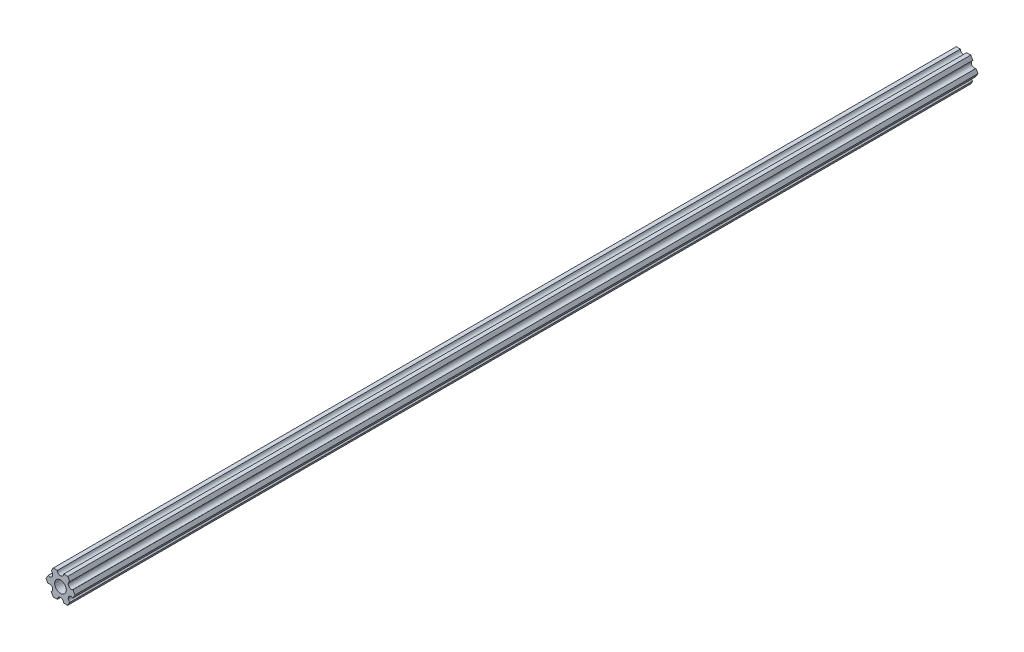
ISO-10303-21;
HEADER;
FILE_DESCRIPTION(('STEP AP214'),'2;1');
FILE_NAME('part.step','',(''),(''),'','','');
FILE_SCHEMA(('AUTOMOTIVE_DESIGN { 1 0 10303 214 1 1 1 1 }'));
ENDSEC;
DATA;
#1=APPLICATION_CONTEXT('core data for automotive mechanical design processes');
#2=APPLICATION_PROTOCOL_DEFINITION('international standard','automotive_design',2000,#1);
#3=PRODUCT_CONTEXT('',#1,'mechanical');
#4=PRODUCT('Part','Part','',(#3));
#5=PRODUCT_RELATED_PRODUCT_CATEGORY('part','',(#4));
#6=PRODUCT_DEFINITION_FORMATION('','',#4);
#7=PRODUCT_DEFINITION_CONTEXT('part definition',#1,'design');
#8=PRODUCT_DEFINITION('design','',#6,#7);
#9=PRODUCT_DEFINITION_SHAPE('','',#8);
#10=(LENGTH_UNIT() NAMED_UNIT(*) SI_UNIT(.MILLI.,.METRE.));
#11=(NAMED_UNIT(*) PLANE_ANGLE_UNIT() SI_UNIT($,.RADIAN.));
#12=(NAMED_UNIT(*) SI_UNIT($,.STERADIAN.) SOLID_ANGLE_UNIT());
#13=UNCERTAINTY_MEASURE_WITH_UNIT(LENGTH_MEASURE(1.E-05),#10,'distance_accuracy_value','');
#14=(GEOMETRIC_REPRESENTATION_CONTEXT(3) GLOBAL_UNCERTAINTY_ASSIGNED_CONTEXT((#13)) GLOBAL_UNIT_ASSIGNED_CONTEXT((#10,
#11,#12)) REPRESENTATION_CONTEXT('',''));
#15=CARTESIAN_POINT('',(0.,0.,0.));
#16=DIRECTION('',(0.,0.,1.));
#17=DIRECTION('',(1.,0.,0.));
#18=AXIS2_PLACEMENT_3D('',#15,#16,#17);
#19=CARTESIAN_POINT('',(0.,0.,228.6));
#20=DIRECTION('',(0.,0.,-1.));
#21=DIRECTION('',(-1.,0.,0.));
#22=AXIS2_PLACEMENT_3D('',#19,#20,#21);
#23=CYLINDRICAL_SURFACE('',#22,2.9337);
#24=DIRECTION('',(0.,0.,-1.));
#25=VECTOR('',#24,1.);
#26=CARTESIAN_POINT('',(2.9337,0.,228.6));
#27=LINE('',#26,#25);
#28=CARTESIAN_POINT('',(2.9337,0.,228.6));
#29=VERTEX_POINT('',#28);
#30=CARTESIAN_POINT('',(2.9337,0.,-228.6));
#31=VERTEX_POINT('',#30);
#32=EDGE_CURVE('E225',#29,#31,#27,.T.);
#33=ORIENTED_EDGE('',*,*,#32,.F.);
#34=CARTESIAN_POINT('',(0.,0.,228.6));
#35=DIRECTION('',(0.,0.,1.));
#36=DIRECTION('',(1.,0.,0.));
#37=AXIS2_PLACEMENT_3D('',#34,#35,#36);
#38=CIRCLE('',#37,2.9337);
#39=CARTESIAN_POINT('',(-2.9337,0.,228.6));
#40=VERTEX_POINT('',#39);
#41=EDGE_CURVE('E220',#29,#40,#38,.T.);
#42=ORIENTED_EDGE('',*,*,#41,.T.);
#43=DIRECTION('',(0.,0.,-1.));
#44=VECTOR('',#43,1.);
#45=CARTESIAN_POINT('',(-2.9337,0.,228.6));
#46=LINE('',#45,#44);
#47=CARTESIAN_POINT('',(-2.9337,0.,-228.6));
#48=VERTEX_POINT('',#47);
#49=EDGE_CURVE('E222',#40,#48,#46,.T.);
#50=ORIENTED_EDGE('',*,*,#49,.T.);
#51=CARTESIAN_POINT('',(0.,0.,-228.6));
#52=DIRECTION('',(0.,0.,1.));
#53=DIRECTION('',(1.,0.,0.));
#54=AXIS2_PLACEMENT_3D('',#51,#52,#53);
#55=CIRCLE('',#54,2.9337);
#56=EDGE_CURVE('E381',#31,#48,#55,.T.);
#57=ORIENTED_EDGE('',*,*,#56,.F.);
#58=EDGE_LOOP('',(#33,#42,#50,#57));
#59=FACE_BOUND('',#58,.T.);
#60=ADVANCED_FACE('F16',(#59),#23,.F.);
#61=CARTESIAN_POINT('',(5.49926150638082,-3.17499966684067,228.6));
#62=DIRECTION('',(0.,0.,-1.));
#63=DIRECTION('',(-1.,0.,0.));
#64=AXIS2_PLACEMENT_3D('',#61,#62,#63);
#65=CYLINDRICAL_SURFACE('',#64,1.5875);
#66=DIRECTION('',(0.,0.,-1.));
#67=VECTOR('',#66,1.);
#68=CARTESIAN_POINT('',(3.91176150638082,-3.17499966684067,228.6));
#69=LINE('',#68,#67);
#70=CARTESIAN_POINT('',(3.91176150638082,-3.17499966684067,228.6));
#71=VERTEX_POINT('',#70);
#72=CARTESIAN_POINT('',(3.91176150638082,-3.17499966684067,-228.6));
#73=VERTEX_POINT('',#72);
#74=EDGE_CURVE('E274',#71,#73,#69,.T.);
#75=ORIENTED_EDGE('',*,*,#74,.F.);
#76=CARTESIAN_POINT('',(5.49926150638082,-3.17499966684067,228.6));
#77=DIRECTION('',(0.,0.,-1.));
#78=DIRECTION('',(1.,0.,0.));
#79=AXIS2_PLACEMENT_3D('',#76,#77,#78);
#80=CIRCLE('',#79,1.5875);
#81=CARTESIAN_POINT('',(4.70551158967065,-4.54981504343587,228.6));
#82=VERTEX_POINT('',#81);
#83=EDGE_CURVE('E231',#82,#71,#80,.T.);
#84=ORIENTED_EDGE('',*,*,#83,.F.);
#85=DIRECTION('',(0.,0.,-1.));
#86=VECTOR('',#85,1.);
#87=CARTESIAN_POINT('',(4.70551158967065,-4.54981504343587,228.6));
#88=LINE('',#87,#86);
#89=CARTESIAN_POINT('',(4.70551158967065,-4.54981504343587,-228.6));
#90=VERTEX_POINT('',#89);
#91=EDGE_CURVE('E10',#82,#90,#88,.T.);
#92=ORIENTED_EDGE('',*,*,#91,.T.);
#93=CARTESIAN_POINT('',(5.49926150638082,-3.17499966684067,-228.6));
#94=DIRECTION('',(0.,0.,-1.));
#95=DIRECTION('',(1.,0.,0.));
#96=AXIS2_PLACEMENT_3D('',#93,#94,#95);
#97=CIRCLE('',#96,1.5875);
#98=EDGE_CURVE('E262',#90,#73,#97,.T.);
#99=ORIENTED_EDGE('',*,*,#98,.T.);
#100=EDGE_LOOP('',(#75,#84,#92,#99));
#101=FACE_BOUND('',#100,.T.);
#102=ADVANCED_FACE('F974',(#101),#65,.F.);
#103=CARTESIAN_POINT('',(3.66617459405346,-6.34999977789375,228.6));
#104=DIRECTION('',(-0.86602543407573,0.499999947533941,0.));
#105=DIRECTION('',(0.,0.,1.));
#106=AXIS2_PLACEMENT_3D('',#103,#104,#105);
#107=PLANE('',#106);
#108=DIRECTION('',(0.499999947533941,0.86602543407573,0.));
#109=VECTOR('',#108,1.);
#110=CARTESIAN_POINT('',(3.66617459405346,-6.34999977789375,-228.6));
#111=LINE('',#110,#109);
#112=CARTESIAN_POINT('',(3.66617459405346,-6.34999977789375,-228.6));
#113=VERTEX_POINT('',#112);
#114=EDGE_CURVE('E257',#113,#90,#111,.T.);
#115=ORIENTED_EDGE('',*,*,#114,.T.);
#116=ORIENTED_EDGE('',*,*,#91,.F.);
#117=DIRECTION('',(0.499999947533941,0.86602543407573,0.));
#118=VECTOR('',#117,1.);
#119=CARTESIAN_POINT('',(3.66617459405346,-6.34999977789375,228.6));
#120=LINE('',#119,#118);
#121=CARTESIAN_POINT('',(3.66617459405346,-6.34999977789375,228.6));
#122=VERTEX_POINT('',#121);
#123=EDGE_CURVE('E318',#122,#82,#120,.T.);
#124=ORIENTED_EDGE('',*,*,#123,.F.);
#125=DIRECTION('',(0.,0.,-1.));
#126=VECTOR('',#125,1.);
#127=CARTESIAN_POINT('',(3.66617459405346,-6.34999977789375,228.6));
#128=LINE('',#127,#126);
#129=EDGE_CURVE('E25',#122,#113,#128,.T.);
#130=ORIENTED_EDGE('',*,*,#129,.T.);
#131=EDGE_LOOP('',(#115,#116,#124,#130));
#132=FACE_BOUND('',#131,.T.);
#133=ADVANCED_FACE('F965',(#132),#107,.F.);
#134=CARTESIAN_POINT('',(1.58750038469926,-6.34999990382518,228.6));
#135=DIRECTION('',(-6.05825721258438E-08,1.,0.));
#136=DIRECTION('',(0.,0.,1.));
#137=AXIS2_PLACEMENT_3D('',#134,#135,#136);
#138=PLANE('',#137);
#139=DIRECTION('',(1.,6.05825721258438E-08,0.));
#140=VECTOR('',#139,1.);
#141=CARTESIAN_POINT('',(1.58750038469926,-6.34999990382518,-228.6));
#142=LINE('',#141,#140);
#143=CARTESIAN_POINT('',(1.58750038469926,-6.34999990382518,-228.6));
#144=VERTEX_POINT('',#143);
#145=EDGE_CURVE('E261',#144,#113,#142,.T.);
#146=ORIENTED_EDGE('',*,*,#145,.T.);
#147=ORIENTED_EDGE('',*,*,#129,.F.);
#148=DIRECTION('',(1.,6.05825721258438E-08,0.));
#149=VECTOR('',#148,1.);
#150=CARTESIAN_POINT('',(1.58750038469926,-6.34999990382518,228.6));
#151=LINE('',#150,#149);
#152=CARTESIAN_POINT('',(1.58750038469926,-6.34999990382518,228.6));
#153=VERTEX_POINT('',#152);
#154=EDGE_CURVE('E322',#153,#122,#151,.T.);
#155=ORIENTED_EDGE('',*,*,#154,.F.);
#156=DIRECTION('',(0.,0.,-1.));
#157=VECTOR('',#156,1.);
#158=CARTESIAN_POINT('',(1.58750038469926,-6.34999990382518,228.6));
#159=LINE('',#158,#157);
#160=EDGE_CURVE('E19',#153,#144,#159,.T.);
#161=ORIENTED_EDGE('',*,*,#160,.T.);
#162=EDGE_LOOP('',(#146,#147,#155,#161));
#163=FACE_BOUND('',#162,.T.);
#164=ADVANCED_FACE('F957',(#163),#138,.F.);
#165=CARTESIAN_POINT('',(3.8469926204343E-07,-6.35,228.6));
#166=DIRECTION('',(0.,0.,-1.));
#167=DIRECTION('',(-1.,0.,0.));
#168=AXIS2_PLACEMENT_3D('',#165,#166,#167);
#169=CYLINDRICAL_SURFACE('',#168,1.5875);
#170=CARTESIAN_POINT('',(3.8469926204343E-07,-6.35,-228.6));
#171=DIRECTION('',(0.,0.,-1.));
#172=DIRECTION('',(1.,0.,0.));
#173=AXIS2_PLACEMENT_3D('',#170,#171,#172);
#174=CIRCLE('',#173,1.5875);
#175=CARTESIAN_POINT('',(-1.58749961530073,-6.35000009617482,-228.6));
#176=VERTEX_POINT('',#175);
#177=EDGE_CURVE('E342',#176,#144,#174,.T.);
#178=ORIENTED_EDGE('',*,*,#177,.T.);
#179=ORIENTED_EDGE('',*,*,#160,.F.);
#180=CARTESIAN_POINT('',(3.8469926204343E-07,-6.35,228.6));
#181=DIRECTION('',(0.,0.,-1.));
#182=DIRECTION('',(1.,0.,0.));
#183=AXIS2_PLACEMENT_3D('',#180,#181,#182);
#184=CIRCLE('',#183,1.5875);
#185=CARTESIAN_POINT('',(-1.58749961530073,-6.35000009617482,228.6));
#186=VERTEX_POINT('',#185);
#187=EDGE_CURVE('E386',#186,#153,#184,.T.);
#188=ORIENTED_EDGE('',*,*,#187,.F.);
#189=DIRECTION('',(0.,0.,-1.));
#190=VECTOR('',#189,1.);
#191=CARTESIAN_POINT('',(-1.58749961530073,-6.35000009617482,228.6));
#192=LINE('',#191,#190);
#193=EDGE_CURVE('E387',#186,#176,#192,.T.);
#194=ORIENTED_EDGE('',*,*,#193,.T.);
#195=EDGE_LOOP('',(#178,#179,#188,#194));
#196=FACE_BOUND('',#195,.T.);
#197=ADVANCED_FACE('F472',(#196),#169,.F.);
#198=CARTESIAN_POINT('',(-3.66617382465481,-6.35000022210628,228.6));
#199=DIRECTION('',(-6.05825854783851E-08,1.,0.));
#200=DIRECTION('',(0.,0.,1.));
#201=AXIS2_PLACEMENT_3D('',#198,#199,#200);
#202=PLANE('',#201);
#203=DIRECTION('',(1.,6.05825854783851E-08,0.));
#204=VECTOR('',#203,1.);
#205=CARTESIAN_POINT('',(-3.66617382465481,-6.35000022210628,-228.6));
#206=LINE('',#205,#204);
#207=CARTESIAN_POINT('',(-3.66617382465481,-6.35000022210628,-228.6));
#208=VERTEX_POINT('',#207);
#209=EDGE_CURVE('E409',#208,#176,#206,.T.);
#210=ORIENTED_EDGE('',*,*,#209,.T.);
#211=ORIENTED_EDGE('',*,*,#193,.F.);
#212=DIRECTION('',(1.,6.05825854783851E-08,0.));
#213=VECTOR('',#212,1.);
#214=CARTESIAN_POINT('',(-3.66617382465481,-6.35000022210628,228.6));
#215=LINE('',#214,#213);
#216=CARTESIAN_POINT('',(-3.66617382465481,-6.35000022210628,228.6));
#217=VERTEX_POINT('',#216);
#218=EDGE_CURVE('E300',#217,#186,#215,.T.);
#219=ORIENTED_EDGE('',*,*,#218,.F.);
#220=DIRECTION('',(0.,0.,-1.));
#221=VECTOR('',#220,1.);
#222=CARTESIAN_POINT('',(-3.66617382465481,-6.35000022210628,228.6));
#223=LINE('',#222,#221);
#224=EDGE_CURVE('E390',#217,#208,#223,.T.);
#225=ORIENTED_EDGE('',*,*,#224,.T.);
#226=EDGE_LOOP('',(#210,#211,#219,#225));
#227=FACE_BOUND('',#226,.T.);
#228=ADVANCED_FACE('F459',(#227),#202,.F.);
#229=CARTESIAN_POINT('',(-4.70551103839172,-4.54981561357972,228.6));
#230=DIRECTION('',(0.866025373493152,0.500000052466045,0.));
#231=DIRECTION('',(0.,0.,-1.));
#232=AXIS2_PLACEMENT_3D('',#229,#230,#231);
#233=PLANE('',#232);
#234=DIRECTION('',(0.500000052466045,-0.866025373493152,0.));
#235=VECTOR('',#234,1.);
#236=CARTESIAN_POINT('',(-4.70551103839172,-4.54981561357972,-228.6));
#237=LINE('',#236,#235);
#238=CARTESIAN_POINT('',(-4.70551103839172,-4.54981561357972,-228.6));
#239=VERTEX_POINT('',#238);
#240=EDGE_CURVE('E338',#239,#208,#237,.T.);
#241=ORIENTED_EDGE('',*,*,#240,.T.);
#242=ORIENTED_EDGE('',*,*,#224,.F.);
#243=DIRECTION('',(0.500000052466045,-0.866025373493152,0.));
#244=VECTOR('',#243,1.);
#245=CARTESIAN_POINT('',(-4.70551103839172,-4.54981561357972,228.6));
#246=LINE('',#245,#244);
#247=CARTESIAN_POINT('',(-4.70551103839172,-4.54981561357972,228.6));
#248=VERTEX_POINT('',#247);
#249=EDGE_CURVE('E296',#248,#217,#246,.T.);
#250=ORIENTED_EDGE('',*,*,#249,.F.);
#251=DIRECTION('',(0.,0.,-1.));
#252=VECTOR('',#251,1.);
#253=CARTESIAN_POINT('',(-4.70551103839172,-4.54981561357972,228.6));
#254=LINE('',#253,#252);
#255=EDGE_CURVE('E360',#248,#239,#254,.T.);
#256=ORIENTED_EDGE('',*,*,#255,.T.);
#257=EDGE_LOOP('',(#241,#242,#250,#256));
#258=FACE_BOUND('',#257,.T.);
#259=ADVANCED_FACE('F465',(#258),#233,.F.);
#260=CARTESIAN_POINT('',(-5.49926112168156,-3.17500033315934,228.6));
#261=DIRECTION('',(0.,0.,-1.));
#262=DIRECTION('',(-1.,0.,0.));
#263=AXIS2_PLACEMENT_3D('',#260,#261,#262);
#264=CYLINDRICAL_SURFACE('',#263,1.5875);
#265=CARTESIAN_POINT('',(-5.49926112168156,-3.17500033315934,-228.6));
#266=DIRECTION('',(0.,0.,-1.));
#267=DIRECTION('',(1.,0.,0.));
#268=AXIS2_PLACEMENT_3D('',#265,#266,#267);
#269=CIRCLE('',#268,1.5875);
#270=CARTESIAN_POINT('',(-6.29301120497141,-1.80018505273897,-228.6));
#271=VERTEX_POINT('',#270);
#272=EDGE_CURVE('E333',#271,#239,#269,.T.);
#273=ORIENTED_EDGE('',*,*,#272,.T.);
#274=ORIENTED_EDGE('',*,*,#255,.F.);
#275=CARTESIAN_POINT('',(-5.49926112168156,-3.17500033315934,228.6));
#276=DIRECTION('',(0.,0.,-1.));
#277=DIRECTION('',(1.,0.,0.));
#278=AXIS2_PLACEMENT_3D('',#275,#276,#277);
#279=CIRCLE('',#278,1.5875);
#280=CARTESIAN_POINT('',(-6.29301120497141,-1.80018505273897,228.6));
#281=VERTEX_POINT('',#280);
#282=EDGE_CURVE('E301',#281,#248,#279,.T.);
#283=ORIENTED_EDGE('',*,*,#282,.F.);
#284=DIRECTION('',(0.,0.,-1.));
#285=VECTOR('',#284,1.);
#286=CARTESIAN_POINT('',(-6.29301120497141,-1.80018505273897,228.6));
#287=LINE('',#286,#285);
#288=EDGE_CURVE('E357',#281,#271,#287,.T.);
#289=ORIENTED_EDGE('',*,*,#288,.T.);
#290=EDGE_LOOP('',(#273,#274,#283,#289));
#291=FACE_BOUND('',#290,.T.);
#292=ADVANCED_FACE('F478',(#291),#264,.F.);
#293=CARTESIAN_POINT('',(-7.33234841870827,-4.44212523790841E-07,228.6));
#294=DIRECTION('',(0.866025373493151,0.500000052466045,0.));
#295=DIRECTION('',(0.,0.,-1.));
#296=AXIS2_PLACEMENT_3D('',#293,#294,#295);
#297=PLANE('',#296);
#298=DIRECTION('',(0.500000052466045,-0.866025373493151,0.));
#299=VECTOR('',#298,1.);
#300=CARTESIAN_POINT('',(-7.33234841870827,-4.44212523790841E-07,-228.6));
#301=LINE('',#300,#299);
#302=CARTESIAN_POINT('',(-7.33234841870827,-4.44212523790841E-07,-228.6));
#303=VERTEX_POINT('',#302);
#304=EDGE_CURVE('E337',#303,#271,#301,.T.);
#305=ORIENTED_EDGE('',*,*,#304,.T.);
#306=ORIENTED_EDGE('',*,*,#288,.F.);
#307=DIRECTION('',(0.500000052466045,-0.866025373493151,0.));
#308=VECTOR('',#307,1.);
#309=CARTESIAN_POINT('',(-7.33234841870827,-4.44212523790841E-07,228.6));
#310=LINE('',#309,#308);
#311=CARTESIAN_POINT('',(-7.33234841870827,-4.44212523790841E-07,228.6));
#312=VERTEX_POINT('',#311);
#313=EDGE_CURVE('E347',#312,#281,#310,.T.);
#314=ORIENTED_EDGE('',*,*,#313,.F.);
#315=DIRECTION('',(0.,0.,-1.));
#316=VECTOR('',#315,1.);
#317=CARTESIAN_POINT('',(-7.33234841870827,-4.44212523790841E-07,228.6));
#318=LINE('',#317,#316);
#319=EDGE_CURVE('E361',#312,#303,#318,.T.);
#320=ORIENTED_EDGE('',*,*,#319,.T.);
#321=EDGE_LOOP('',(#305,#306,#314,#320));
#322=FACE_BOUND('',#321,.T.);
#323=ADVANCED_FACE('F483',(#322),#297,.F.);
#324=CARTESIAN_POINT('',(-6.29301142309098,1.80018429024547,228.6));
#325=DIRECTION('',(0.866025434075724,-0.499999947533952,0.));
#326=DIRECTION('',(0.,0.,-1.));
#327=AXIS2_PLACEMENT_3D('',#324,#325,#326);
#328=PLANE('',#327);
#329=DIRECTION('',(-0.499999947533951,-0.866025434075724,0.));
#330=VECTOR('',#329,1.);
#331=CARTESIAN_POINT('',(-6.29301142309098,1.80018429024547,-228.6));
#332=LINE('',#331,#330);
#333=CARTESIAN_POINT('',(-6.29301142309098,1.80018429024547,-228.6));
#334=VERTEX_POINT('',#333);
#335=EDGE_CURVE('E314',#334,#303,#332,.T.);
#336=ORIENTED_EDGE('',*,*,#335,.T.);
#337=ORIENTED_EDGE('',*,*,#319,.F.);
#338=DIRECTION('',(-0.499999947533951,-0.866025434075724,0.));
#339=VECTOR('',#338,1.);
#340=CARTESIAN_POINT('',(-6.29301142309098,1.80018429024547,228.6));
#341=LINE('',#340,#339);
#342=CARTESIAN_POINT('',(-6.29301142309098,1.80018429024547,228.6));
#343=VERTEX_POINT('',#342);
#344=EDGE_CURVE('E343',#343,#312,#341,.T.);
#345=ORIENTED_EDGE('',*,*,#344,.F.);
#346=DIRECTION('',(0.,0.,-1.));
#347=VECTOR('',#346,1.);
#348=CARTESIAN_POINT('',(-6.29301142309098,1.80018429024547,228.6));
#349=LINE('',#348,#347);
#350=EDGE_CURVE('E446',#343,#334,#349,.T.);
#351=ORIENTED_EDGE('',*,*,#350,.T.);
#352=EDGE_LOOP('',(#336,#337,#345,#351));
#353=FACE_BOUND('',#352,.T.);
#354=ADVANCED_FACE('F486',(#353),#328,.F.);
#355=CARTESIAN_POINT('',(-5.49926150638082,3.17499966684067,228.6));
#356=DIRECTION('',(0.,0.,-1.));
#357=DIRECTION('',(-1.,0.,0.));
#358=AXIS2_PLACEMENT_3D('',#355,#356,#357);
#359=CYLINDRICAL_SURFACE('',#358,1.5875);
#360=CARTESIAN_POINT('',(-5.49926150638082,3.17499966684067,-228.6));
#361=DIRECTION('',(0.,0.,-1.));
#362=DIRECTION('',(1.,0.,0.));
#363=AXIS2_PLACEMENT_3D('',#360,#361,#362);
#364=CIRCLE('',#363,1.5875);
#365=CARTESIAN_POINT('',(-4.70551158967065,4.54981504343587,-228.6));
#366=VERTEX_POINT('',#365);
#367=EDGE_CURVE('E309',#366,#334,#364,.T.);
#368=ORIENTED_EDGE('',*,*,#367,.T.);
#369=ORIENTED_EDGE('',*,*,#350,.F.);
#370=CARTESIAN_POINT('',(-5.49926150638082,3.17499966684067,228.6));
#371=DIRECTION('',(0.,0.,-1.));
#372=DIRECTION('',(1.,0.,0.));
#373=AXIS2_PLACEMENT_3D('',#370,#371,#372);
#374=CIRCLE('',#373,1.5875);
#375=CARTESIAN_POINT('',(-4.70551158967065,4.54981504343587,228.6));
#376=VERTEX_POINT('',#375);
#377=EDGE_CURVE('E348',#376,#343,#374,.T.);
#378=ORIENTED_EDGE('',*,*,#377,.F.);
#379=DIRECTION('',(0.,0.,-1.));
#380=VECTOR('',#379,1.);
#381=CARTESIAN_POINT('',(-4.70551158967065,4.54981504343587,228.6));
#382=LINE('',#381,#380);
#383=EDGE_CURVE('E445',#376,#366,#382,.T.);
#384=ORIENTED_EDGE('',*,*,#383,.T.);
#385=EDGE_LOOP('',(#368,#369,#378,#384));
#386=FACE_BOUND('',#385,.T.);
#387=ADVANCED_FACE('F489',(#386),#359,.F.);
#388=CARTESIAN_POINT('',(-3.66617459405349,6.3499997778937,228.6));
#389=DIRECTION('',(0.866025434075729,-0.499999947533942,0.));
#390=DIRECTION('',(0.,0.,-1.));
#391=AXIS2_PLACEMENT_3D('',#388,#389,#390);
#392=PLANE('',#391);
#393=DIRECTION('',(-0.499999947533943,-0.866025434075729,0.));
#394=VECTOR('',#393,1.);
#395=CARTESIAN_POINT('',(-3.66617459405349,6.3499997778937,-228.6));
#396=LINE('',#395,#394);
#397=CARTESIAN_POINT('',(-3.66617459405349,6.3499997778937,-228.6));
#398=VERTEX_POINT('',#397);
#399=EDGE_CURVE('E313',#398,#366,#396,.T.);
#400=ORIENTED_EDGE('',*,*,#399,.T.);
#401=ORIENTED_EDGE('',*,*,#383,.F.);
#402=DIRECTION('',(-0.499999947533943,-0.866025434075729,0.));
#403=VECTOR('',#402,1.);
#404=CARTESIAN_POINT('',(-3.66617459405349,6.3499997778937,228.6));
#405=LINE('',#404,#403);
#406=CARTESIAN_POINT('',(-3.66617459405349,6.3499997778937,228.6));
#407=VERTEX_POINT('',#406);
#408=EDGE_CURVE('E365',#407,#376,#405,.T.);
#409=ORIENTED_EDGE('',*,*,#408,.F.);
#410=DIRECTION('',(0.,0.,-1.));
#411=VECTOR('',#410,1.);
#412=CARTESIAN_POINT('',(-3.66617459405349,6.3499997778937,228.6));
#413=LINE('',#412,#411);
#414=EDGE_CURVE('E442',#407,#398,#413,.T.);
#415=ORIENTED_EDGE('',*,*,#414,.T.);
#416=EDGE_LOOP('',(#400,#401,#409,#415));
#417=FACE_BOUND('',#416,.T.);
#418=ADVANCED_FACE('F816',(#417),#392,.F.);
#419=CARTESIAN_POINT('',(-1.58750038469926,6.34999990382518,228.6));
#420=DIRECTION('',(6.05825963273174E-08,-1.,0.));
#421=DIRECTION('',(0.,0.,-1.));
#422=AXIS2_PLACEMENT_3D('',#419,#420,#421);
#423=PLANE('',#422);
#424=DIRECTION('',(-1.,-6.05825963273174E-08,0.));
#425=VECTOR('',#424,1.);
#426=CARTESIAN_POINT('',(-1.58750038469926,6.34999990382518,-228.6));
#427=LINE('',#426,#425);
#428=CARTESIAN_POINT('',(-1.58750038469926,6.34999990382519,-228.6));
#429=VERTEX_POINT('',#428);
#430=EDGE_CURVE('E401',#429,#398,#427,.T.);
#431=ORIENTED_EDGE('',*,*,#430,.T.);
#432=ORIENTED_EDGE('',*,*,#414,.F.);
#433=DIRECTION('',(-1.,-6.05825963273174E-08,0.));
#434=VECTOR('',#433,1.);
#435=CARTESIAN_POINT('',(-1.58750038469926,6.34999990382518,228.6));
#436=LINE('',#435,#434);
#437=CARTESIAN_POINT('',(-1.58750038469926,6.34999990382519,228.6));
#438=VERTEX_POINT('',#437);
#439=EDGE_CURVE('E356',#438,#407,#436,.T.);
#440=ORIENTED_EDGE('',*,*,#439,.F.);
#441=DIRECTION('',(0.,0.,-1.));
#442=VECTOR('',#441,1.);
#443=CARTESIAN_POINT('',(-1.58750038469926,6.34999990382519,228.6));
#444=LINE('',#443,#442);
#445=EDGE_CURVE('E256',#438,#429,#444,.T.);
#446=ORIENTED_EDGE('',*,*,#445,.T.);
#447=EDGE_LOOP('',(#431,#432,#440,#446));
#448=FACE_BOUND('',#447,.T.);
#449=ADVANCED_FACE('F811',(#448),#423,.F.);
#450=CARTESIAN_POINT('',(-3.84699260060323E-07,6.35,228.6));
#451=DIRECTION('',(0.,0.,-1.));
#452=DIRECTION('',(-1.,0.,0.));
#453=AXIS2_PLACEMENT_3D('',#450,#451,#452);
#454=CYLINDRICAL_SURFACE('',#453,1.5875);
#455=CARTESIAN_POINT('',(-3.84699260060323E-07,6.35,-228.6));
#456=DIRECTION('',(0.,0.,-1.));
#457=DIRECTION('',(1.,0.,0.));
#458=AXIS2_PLACEMENT_3D('',#455,#456,#457);
#459=CIRCLE('',#458,1.5875);
#460=CARTESIAN_POINT('',(1.58749961530074,6.35000009617482,-228.6));
#461=VERTEX_POINT('',#460);
#462=EDGE_CURVE('E404',#461,#429,#459,.T.);
#463=ORIENTED_EDGE('',*,*,#462,.T.);
#464=ORIENTED_EDGE('',*,*,#445,.F.);
#465=CARTESIAN_POINT('',(-3.84699260060323E-07,6.35,228.6));
#466=DIRECTION('',(0.,0.,-1.));
#467=DIRECTION('',(1.,0.,0.));
#468=AXIS2_PLACEMENT_3D('',#465,#466,#467);
#469=CIRCLE('',#468,1.5875);
#470=CARTESIAN_POINT('',(1.58749961530074,6.35000009617482,228.6));
#471=VERTEX_POINT('',#470);
#472=EDGE_CURVE('E352',#471,#438,#469,.T.);
#473=ORIENTED_EDGE('',*,*,#472,.F.);
#474=DIRECTION('',(0.,0.,-1.));
#475=VECTOR('',#474,1.);
#476=CARTESIAN_POINT('',(1.58749961530074,6.35000009617482,228.6));
#477=LINE('',#476,#475);
#478=EDGE_CURVE('E253',#471,#461,#477,.T.);
#479=ORIENTED_EDGE('',*,*,#478,.T.);
#480=EDGE_LOOP('',(#463,#464,#473,#479));
#481=FACE_BOUND('',#480,.T.);
#482=ADVANCED_FACE('F815',(#481),#454,.F.);
#483=CARTESIAN_POINT('',(3.66617382465481,6.35000022210627,228.6));
#484=DIRECTION('',(6.05825850611185E-08,-1.,0.));
#485=DIRECTION('',(0.,0.,-1.));
#486=AXIS2_PLACEMENT_3D('',#483,#484,#485);
#487=PLANE('',#486);
#488=DIRECTION('',(-1.,-6.05825850611185E-08,0.));
#489=VECTOR('',#488,1.);
#490=CARTESIAN_POINT('',(3.66617382465481,6.35000022210627,-228.6));
#491=LINE('',#490,#489);
#492=CARTESIAN_POINT('',(3.66617382465481,6.35000022210627,-228.6));
#493=VERTEX_POINT('',#492);
#494=EDGE_CURVE('E425',#493,#461,#491,.T.);
#495=ORIENTED_EDGE('',*,*,#494,.T.);
#496=ORIENTED_EDGE('',*,*,#478,.F.);
#497=DIRECTION('',(-1.,-6.05825850611185E-08,0.));
#498=VECTOR('',#497,1.);
#499=CARTESIAN_POINT('',(3.66617382465481,6.35000022210627,228.6));
#500=LINE('',#499,#498);
#501=CARTESIAN_POINT('',(3.66617382465481,6.35000022210627,228.6));
#502=VERTEX_POINT('',#501);
#503=EDGE_CURVE('E332',#502,#471,#500,.T.);
#504=ORIENTED_EDGE('',*,*,#503,.F.);
#505=DIRECTION('',(0.,0.,-1.));
#506=VECTOR('',#505,1.);
#507=CARTESIAN_POINT('',(3.66617382465481,6.35000022210627,228.6));
#508=LINE('',#507,#506);
#509=EDGE_CURVE('E50',#502,#493,#508,.T.);
#510=ORIENTED_EDGE('',*,*,#509,.T.);
#511=EDGE_LOOP('',(#495,#496,#504,#510));
#512=FACE_BOUND('',#511,.T.);
#513=ADVANCED_FACE('F891',(#512),#487,.F.);
#514=CARTESIAN_POINT('',(4.70551103839172,4.54981561357972,228.6));
#515=DIRECTION('',(-0.866025373493151,-0.500000052466046,0.));
#516=DIRECTION('',(-0.500000052466046,0.866025373493151,0.));
#517=AXIS2_PLACEMENT_3D('',#514,#515,#516);
#518=PLANE('',#517);
#519=DIRECTION('',(-0.500000052466046,0.866025373493151,0.));
#520=VECTOR('',#519,1.);
#521=CARTESIAN_POINT('',(4.70551103839172,4.54981561357972,-228.6));
#522=LINE('',#521,#520);
#523=CARTESIAN_POINT('',(4.70551103839172,4.54981561357972,-228.6));
#524=VERTEX_POINT('',#523);
#525=EDGE_CURVE('E428',#524,#493,#522,.T.);
#526=ORIENTED_EDGE('',*,*,#525,.T.);
#527=ORIENTED_EDGE('',*,*,#509,.F.);
#528=DIRECTION('',(-0.500000052466046,0.866025373493151,0.));
#529=VECTOR('',#528,1.);
#530=CARTESIAN_POINT('',(4.70551103839172,4.54981561357972,228.6));
#531=LINE('',#530,#529);
#532=CARTESIAN_POINT('',(4.70551103839172,4.54981561357972,228.6));
#533=VERTEX_POINT('',#532);
#534=EDGE_CURVE('E328',#533,#502,#531,.T.);
#535=ORIENTED_EDGE('',*,*,#534,.F.);
#536=DIRECTION('',(0.,0.,-1.));
#537=VECTOR('',#536,1.);
#538=CARTESIAN_POINT('',(4.70551103839172,4.54981561357972,228.6));
#539=LINE('',#538,#537);
#540=EDGE_CURVE('E269',#533,#524,#539,.T.);
#541=ORIENTED_EDGE('',*,*,#540,.T.);
#542=EDGE_LOOP('',(#526,#527,#535,#541));
#543=FACE_BOUND('',#542,.T.);
#544=ADVANCED_FACE('F875',(#543),#518,.F.);
#545=CARTESIAN_POINT('',(5.49926112168156,3.17500033315934,228.6));
#546=DIRECTION('',(0.,0.,-1.));
#547=DIRECTION('',(-1.,0.,0.));
#548=AXIS2_PLACEMENT_3D('',#545,#546,#547);
#549=CYLINDRICAL_SURFACE('',#548,1.5875);
#550=DIRECTION('',(0.,0.,-1.));
#551=VECTOR('',#550,1.);
#552=CARTESIAN_POINT('',(3.91176112168156,3.17500033315934,228.6));
#553=LINE('',#552,#551);
#554=CARTESIAN_POINT('',(3.91176112168156,3.17500033315934,228.6));
#555=VERTEX_POINT('',#554);
#556=CARTESIAN_POINT('',(3.91176112168156,3.17500033315934,-228.6));
#557=VERTEX_POINT('',#556);
#558=EDGE_CURVE('E308',#555,#557,#553,.T.);
#559=ORIENTED_EDGE('',*,*,#558,.F.);
#560=CARTESIAN_POINT('',(5.49926112168156,3.17500033315934,228.6));
#561=DIRECTION('',(0.,0.,-1.));
#562=DIRECTION('',(1.,0.,0.));
#563=AXIS2_PLACEMENT_3D('',#560,#561,#562);
#564=CIRCLE('',#563,1.5875);
#565=CARTESIAN_POINT('',(6.29301120497139,1.80018505273894,228.6));
#566=VERTEX_POINT('',#565);
#567=EDGE_CURVE('E266',#566,#555,#564,.T.);
#568=ORIENTED_EDGE('',*,*,#567,.F.);
#569=DIRECTION('',(0.,0.,-1.));
#570=VECTOR('',#569,1.);
#571=CARTESIAN_POINT('',(6.29301120497139,1.80018505273894,228.6));
#572=LINE('',#571,#570);
#573=CARTESIAN_POINT('',(6.29301120497139,1.80018505273894,-228.6));
#574=VERTEX_POINT('',#573);
#575=EDGE_CURVE('E39',#566,#574,#572,.T.);
#576=ORIENTED_EDGE('',*,*,#575,.T.);
#577=CARTESIAN_POINT('',(5.49926112168156,3.17500033315934,-228.6));
#578=DIRECTION('',(0.,0.,-1.));
#579=DIRECTION('',(1.,0.,0.));
#580=AXIS2_PLACEMENT_3D('',#577,#578,#579);
#581=CIRCLE('',#580,1.5875);
#582=EDGE_CURVE('E382',#574,#557,#581,.T.);
#583=ORIENTED_EDGE('',*,*,#582,.T.);
#584=EDGE_LOOP('',(#559,#568,#576,#583));
#585=FACE_BOUND('',#584,.T.);
#586=ADVANCED_FACE('F871',(#585),#549,.F.);
#587=CARTESIAN_POINT('',(7.33234841870827,4.44212519169686E-07,228.6));
#588=DIRECTION('',(-0.866025373493145,-0.500000052466057,0.));
#589=DIRECTION('',(-0.500000052466057,0.866025373493145,0.));
#590=AXIS2_PLACEMENT_3D('',#587,#588,#589);
#591=PLANE('',#590);
#592=DIRECTION('',(-0.500000052466057,0.866025373493145,0.));
#593=VECTOR('',#592,1.);
#594=CARTESIAN_POINT('',(7.33234841870827,4.44212519169686E-07,-228.6));
#595=LINE('',#594,#593);
#596=CARTESIAN_POINT('',(7.33234841870827,4.44212519169686E-07,-228.6));
#597=VERTEX_POINT('',#596);
#598=EDGE_CURVE('E378',#597,#574,#595,.T.);
#599=ORIENTED_EDGE('',*,*,#598,.T.);
#600=ORIENTED_EDGE('',*,*,#575,.F.);
#601=DIRECTION('',(-0.500000052466057,0.866025373493145,0.));
#602=VECTOR('',#601,1.);
#603=CARTESIAN_POINT('',(7.33234841870827,4.44212519169686E-07,228.6));
#604=LINE('',#603,#602);
#605=CARTESIAN_POINT('',(7.33234841870827,4.44212519169686E-07,228.6));
#606=VERTEX_POINT('',#605);
#607=EDGE_CURVE('E263',#606,#566,#604,.T.);
#608=ORIENTED_EDGE('',*,*,#607,.F.);
#609=DIRECTION('',(0.,0.,-1.));
#610=VECTOR('',#609,1.);
#611=CARTESIAN_POINT('',(7.33234841870827,4.44212519169686E-07,228.6));
#612=LINE('',#611,#610);
#613=EDGE_CURVE('E435',#606,#597,#612,.T.);
#614=ORIENTED_EDGE('',*,*,#613,.T.);
#615=EDGE_LOOP('',(#599,#600,#608,#614));
#616=FACE_BOUND('',#615,.T.);
#617=ADVANCED_FACE('F865',(#616),#591,.F.);
#618=CARTESIAN_POINT('',(6.29301142309098,-1.80018429024546,228.6));
#619=DIRECTION('',(-0.866025434075723,0.499999947533953,0.));
#620=DIRECTION('',(0.,0.,1.));
#621=AXIS2_PLACEMENT_3D('',#618,#619,#620);
#622=PLANE('',#621);
#623=DIRECTION('',(0.499999947533953,0.866025434075723,0.));
#624=VECTOR('',#623,1.);
#625=CARTESIAN_POINT('',(6.29301142309098,-1.80018429024546,-228.6));
#626=LINE('',#625,#624);
#627=CARTESIAN_POINT('',(6.29301142309098,-1.80018429024546,-228.6));
#628=VERTEX_POINT('',#627);
#629=EDGE_CURVE('E230',#628,#597,#626,.T.);
#630=ORIENTED_EDGE('',*,*,#629,.T.);
#631=ORIENTED_EDGE('',*,*,#613,.F.);
#632=DIRECTION('',(0.499999947533953,0.866025434075723,0.));
#633=VECTOR('',#632,1.);
#634=CARTESIAN_POINT('',(6.29301142309098,-1.80018429024546,228.6));
#635=LINE('',#634,#633);
#636=CARTESIAN_POINT('',(6.29301142309098,-1.80018429024546,228.6));
#637=VERTEX_POINT('',#636);
#638=EDGE_CURVE('E267',#637,#606,#635,.T.);
#639=ORIENTED_EDGE('',*,*,#638,.F.);
#640=DIRECTION('',(0.,0.,-1.));
#641=VECTOR('',#640,1.);
#642=CARTESIAN_POINT('',(6.29301142309098,-1.80018429024546,228.6));
#643=LINE('',#642,#641);
#644=EDGE_CURVE('E291',#637,#628,#643,.T.);
#645=ORIENTED_EDGE('',*,*,#644,.T.);
#646=EDGE_LOOP('',(#630,#631,#639,#645));
#647=FACE_BOUND('',#646,.T.);
#648=ADVANCED_FACE('F856',(#647),#622,.F.);
#649=CARTESIAN_POINT('',(5.49926112168156,3.17500033315934,-228.6));
#650=DIRECTION('',(0.,0.,1.));
#651=DIRECTION('',(1.,0.,0.));
#652=AXIS2_PLACEMENT_3D('',#649,#650,#651);
#653=PLANE('',#652);
#654=CARTESIAN_POINT('',(0.,0.,-228.6));
#655=DIRECTION('',(0.,0.,1.));
#656=DIRECTION('',(1.,0.,0.));
#657=AXIS2_PLACEMENT_3D('',#654,#655,#656);
#658=CIRCLE('',#657,2.9337);
#659=EDGE_CURVE('E237',#48,#31,#658,.T.);
#660=ORIENTED_EDGE('',*,*,#659,.T.);
#661=ORIENTED_EDGE('',*,*,#56,.T.);
#662=EDGE_LOOP('',(#660,#661));
#663=FACE_BOUND('',#662,.T.);
#664=ORIENTED_EDGE('',*,*,#629,.F.);
#665=CARTESIAN_POINT('',(5.49926150638082,-3.17499966684067,-228.6));
#666=DIRECTION('',(0.,0.,-1.));
#667=DIRECTION('',(1.,0.,0.));
#668=AXIS2_PLACEMENT_3D('',#665,#666,#667);
#669=CIRCLE('',#668,1.5875);
#670=EDGE_CURVE('E278',#73,#628,#669,.T.);
#671=ORIENTED_EDGE('',*,*,#670,.F.);
#672=ORIENTED_EDGE('',*,*,#98,.F.);
#673=ORIENTED_EDGE('',*,*,#114,.F.);
#674=ORIENTED_EDGE('',*,*,#145,.F.);
#675=ORIENTED_EDGE('',*,*,#177,.F.);
#676=ORIENTED_EDGE('',*,*,#209,.F.);
#677=ORIENTED_EDGE('',*,*,#240,.F.);
#678=ORIENTED_EDGE('',*,*,#272,.F.);
#679=ORIENTED_EDGE('',*,*,#304,.F.);
#680=ORIENTED_EDGE('',*,*,#335,.F.);
#681=ORIENTED_EDGE('',*,*,#367,.F.);
#682=ORIENTED_EDGE('',*,*,#399,.F.);
#683=ORIENTED_EDGE('',*,*,#430,.F.);
#684=ORIENTED_EDGE('',*,*,#462,.F.);
#685=ORIENTED_EDGE('',*,*,#494,.F.);
#686=ORIENTED_EDGE('',*,*,#525,.F.);
#687=CARTESIAN_POINT('',(5.49926112168156,3.17500033315934,-228.6));
#688=DIRECTION('',(0.,0.,-1.));
#689=DIRECTION('',(1.,0.,0.));
#690=AXIS2_PLACEMENT_3D('',#687,#688,#689);
#691=CIRCLE('',#690,1.5875);
#692=EDGE_CURVE('E273',#557,#524,#691,.T.);
#693=ORIENTED_EDGE('',*,*,#692,.F.);
#694=ORIENTED_EDGE('',*,*,#582,.F.);
#695=ORIENTED_EDGE('',*,*,#598,.F.);
#696=EDGE_LOOP('',(#664,#671,#672,#673,#674,#675,#676,#677,#678,#679,#680,#681,#682,#683,#684,
#685,#686,#693,#694,#695));
#697=FACE_BOUND('',#696,.T.);
#698=ADVANCED_FACE('F468',(#663,#697),#653,.F.);
#699=CARTESIAN_POINT('',(5.49926112168156,3.17500033315934,228.6));
#700=DIRECTION('',(0.,0.,1.));
#701=DIRECTION('',(1.,0.,0.));
#702=AXIS2_PLACEMENT_3D('',#699,#700,#701);
#703=PLANE('',#702);
#704=CARTESIAN_POINT('',(0.,0.,228.6));
#705=DIRECTION('',(0.,0.,1.));
#706=DIRECTION('',(1.,0.,0.));
#707=AXIS2_PLACEMENT_3D('',#704,#705,#706);
#708=CIRCLE('',#707,2.9337);
#709=EDGE_CURVE('E235',#40,#29,#708,.T.);
#710=ORIENTED_EDGE('',*,*,#709,.F.);
#711=ORIENTED_EDGE('',*,*,#41,.F.);
#712=EDGE_LOOP('',(#710,#711));
#713=FACE_BOUND('',#712,.T.);
#714=ORIENTED_EDGE('',*,*,#638,.T.);
#715=ORIENTED_EDGE('',*,*,#607,.T.);
#716=ORIENTED_EDGE('',*,*,#567,.T.);
#717=CARTESIAN_POINT('',(5.49926112168156,3.17500033315934,228.6));
#718=DIRECTION('',(0.,0.,-1.));
#719=DIRECTION('',(1.,0.,0.));
#720=AXIS2_PLACEMENT_3D('',#717,#718,#719);
#721=CIRCLE('',#720,1.5875);
#722=EDGE_CURVE('E295',#555,#533,#721,.T.);
#723=ORIENTED_EDGE('',*,*,#722,.T.);
#724=ORIENTED_EDGE('',*,*,#534,.T.);
#725=ORIENTED_EDGE('',*,*,#503,.T.);
#726=ORIENTED_EDGE('',*,*,#472,.T.);
#727=ORIENTED_EDGE('',*,*,#439,.T.);
#728=ORIENTED_EDGE('',*,*,#408,.T.);
#729=ORIENTED_EDGE('',*,*,#377,.T.);
#730=ORIENTED_EDGE('',*,*,#344,.T.);
#731=ORIENTED_EDGE('',*,*,#313,.T.);
#732=ORIENTED_EDGE('',*,*,#282,.T.);
#733=ORIENTED_EDGE('',*,*,#249,.T.);
#734=ORIENTED_EDGE('',*,*,#218,.T.);
#735=ORIENTED_EDGE('',*,*,#187,.T.);
#736=ORIENTED_EDGE('',*,*,#154,.T.);
#737=ORIENTED_EDGE('',*,*,#123,.T.);
#738=ORIENTED_EDGE('',*,*,#83,.T.);
#739=CARTESIAN_POINT('',(5.49926150638082,-3.17499966684067,228.6));
#740=DIRECTION('',(0.,0.,-1.));
#741=DIRECTION('',(1.,0.,0.));
#742=AXIS2_PLACEMENT_3D('',#739,#740,#741);
#743=CIRCLE('',#742,1.5875);
#744=EDGE_CURVE('E239',#71,#637,#743,.T.);
#745=ORIENTED_EDGE('',*,*,#744,.T.);
#746=EDGE_LOOP('',(#714,#715,#716,#723,#724,#725,#726,#727,#728,#729,#730,#731,#732,#733,#734,
#735,#736,#737,#738,#745));
#747=FACE_BOUND('',#746,.T.);
#748=ADVANCED_FACE('F241',(#713,#747),#703,.T.);
#749=CARTESIAN_POINT('',(5.49926112168156,3.17500033315934,228.6));
#750=DIRECTION('',(0.,0.,-1.));
#751=DIRECTION('',(-1.,0.,0.));
#752=AXIS2_PLACEMENT_3D('',#749,#750,#751);
#753=CYLINDRICAL_SURFACE('',#752,1.5875);
#754=ORIENTED_EDGE('',*,*,#722,.F.);
#755=ORIENTED_EDGE('',*,*,#558,.T.);
#756=ORIENTED_EDGE('',*,*,#692,.T.);
#757=ORIENTED_EDGE('',*,*,#540,.F.);
#758=EDGE_LOOP('',(#754,#755,#756,#757));
#759=FACE_BOUND('',#758,.T.);
#760=ADVANCED_FACE('F825',(#759),#753,.F.);
#761=CARTESIAN_POINT('',(5.49926150638082,-3.17499966684067,228.6));
#762=DIRECTION('',(0.,0.,-1.));
#763=DIRECTION('',(-1.,0.,0.));
#764=AXIS2_PLACEMENT_3D('',#761,#762,#763);
#765=CYLINDRICAL_SURFACE('',#764,1.5875);
#766=ORIENTED_EDGE('',*,*,#744,.F.);
#767=ORIENTED_EDGE('',*,*,#74,.T.);
#768=ORIENTED_EDGE('',*,*,#670,.T.);
#769=ORIENTED_EDGE('',*,*,#644,.F.);
#770=EDGE_LOOP('',(#766,#767,#768,#769));
#771=FACE_BOUND('',#770,.T.);
#772=ADVANCED_FACE('F806',(#771),#765,.F.);
#773=CARTESIAN_POINT('',(0.,0.,228.6));
#774=DIRECTION('',(0.,0.,-1.));
#775=DIRECTION('',(-1.,0.,0.));
#776=AXIS2_PLACEMENT_3D('',#773,#774,#775);
#777=CYLINDRICAL_SURFACE('',#776,2.9337);
#778=ORIENTED_EDGE('',*,*,#709,.T.);
#779=ORIENTED_EDGE('',*,*,#32,.T.);
#780=ORIENTED_EDGE('',*,*,#659,.F.);
#781=ORIENTED_EDGE('',*,*,#49,.F.);
#782=EDGE_LOOP('',(#778,#779,#780,#781));
#783=FACE_BOUND('',#782,.T.);
#784=ADVANCED_FACE('F234',(#783),#777,.F.);
#785=CLOSED_SHELL('',(#60,#102,#133,#164,#197,#228,#259,#292,#323,#354,#387,#418,#449,#482,#513,
#544,#586,#617,#648,#698,#748,#760,#772,#784));
#786=MANIFOLD_SOLID_BREP('B1',#785);
#787=ADVANCED_BREP_SHAPE_REPRESENTATION('',(#18,#786),#14);
#788=SHAPE_DEFINITION_REPRESENTATION(#9,#787);
ENDSEC;
END-ISO-10303-21;
